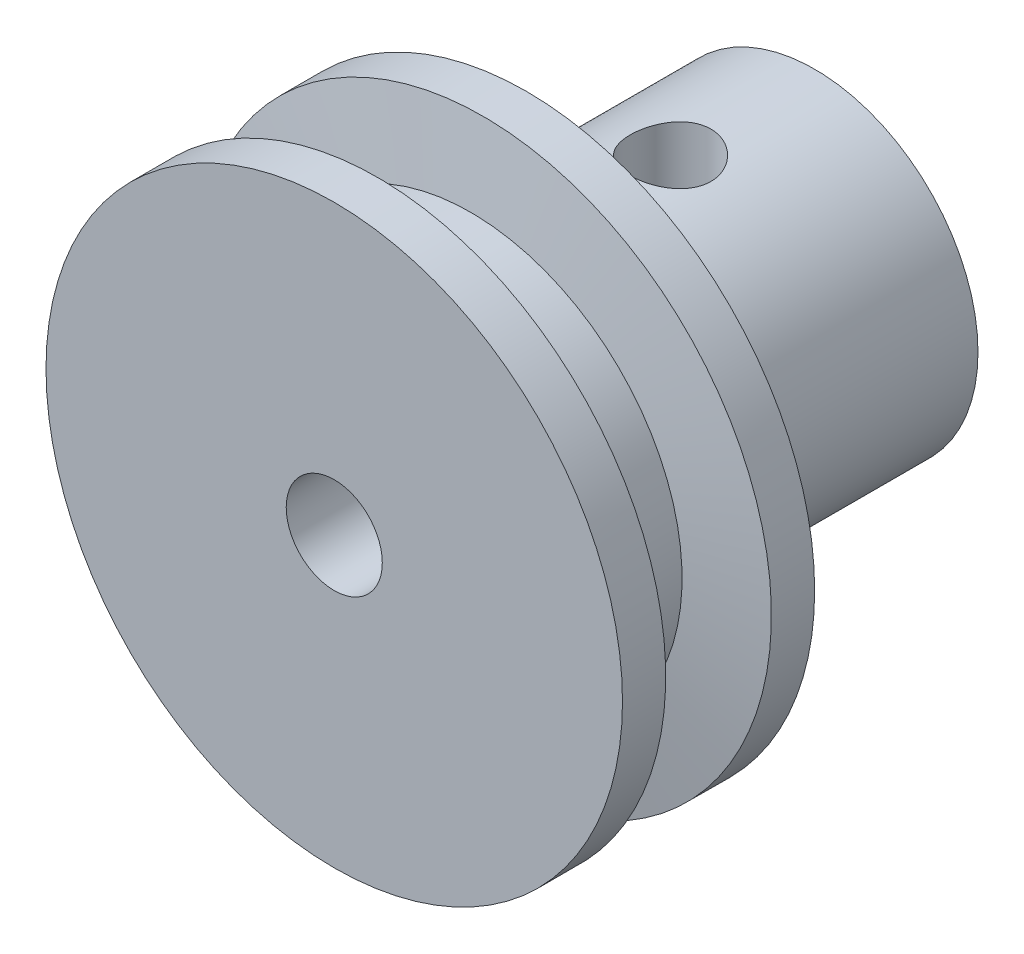
ISO-10303-21;
HEADER;
FILE_DESCRIPTION(('STEP AP214'),'2;1');
FILE_NAME('part.step','',(''),(''),'','','');
FILE_SCHEMA(('AUTOMOTIVE_DESIGN { 1 0 10303 214 1 1 1 1 }'));
ENDSEC;
DATA;
#1=APPLICATION_CONTEXT('core data for automotive mechanical design processes');
#2=APPLICATION_PROTOCOL_DEFINITION('international standard','automotive_design',2000,#1);
#3=PRODUCT_CONTEXT('',#1,'mechanical');
#4=PRODUCT('Part','Part','',(#3));
#5=PRODUCT_RELATED_PRODUCT_CATEGORY('part','',(#4));
#6=PRODUCT_DEFINITION_FORMATION('','',#4);
#7=PRODUCT_DEFINITION_CONTEXT('part definition',#1,'design');
#8=PRODUCT_DEFINITION('design','',#6,#7);
#9=PRODUCT_DEFINITION_SHAPE('','',#8);
#10=(LENGTH_UNIT() NAMED_UNIT(*) SI_UNIT(.MILLI.,.METRE.));
#11=(NAMED_UNIT(*) PLANE_ANGLE_UNIT() SI_UNIT($,.RADIAN.));
#12=(NAMED_UNIT(*) SI_UNIT($,.STERADIAN.) SOLID_ANGLE_UNIT());
#13=UNCERTAINTY_MEASURE_WITH_UNIT(LENGTH_MEASURE(1.E-05),#10,'distance_accuracy_value','');
#14=(GEOMETRIC_REPRESENTATION_CONTEXT(3) GLOBAL_UNCERTAINTY_ASSIGNED_CONTEXT((#13)) GLOBAL_UNIT_ASSIGNED_CONTEXT((#10,
#11,#12)) REPRESENTATION_CONTEXT('',''));
#15=CARTESIAN_POINT('',(0.,0.,0.));
#16=DIRECTION('',(0.,0.,1.));
#17=DIRECTION('',(1.,0.,0.));
#18=AXIS2_PLACEMENT_3D('',#15,#16,#17);
#19=CARTESIAN_POINT('',(0.,0.,0.));
#20=DIRECTION('',(0.,0.,1.));
#21=DIRECTION('',(1.,0.,0.));
#22=AXIS2_PLACEMENT_3D('',#19,#20,#21);
#23=PLANE('',#22);
#24=CARTESIAN_POINT('',(0.,0.,0.));
#25=DIRECTION('',(0.,0.,1.));
#26=DIRECTION('',(1.,0.,0.));
#27=AXIS2_PLACEMENT_3D('',#24,#25,#26);
#28=CIRCLE('',#27,15.);
#29=CARTESIAN_POINT('',(15.,0.,0.));
#30=VERTEX_POINT('',#29);
#31=EDGE_CURVE('E73',#30,#30,#28,.T.);
#32=ORIENTED_EDGE('',*,*,#31,.F.);
#33=EDGE_LOOP('',(#32));
#34=FACE_BOUND('',#33,.T.);
#35=CARTESIAN_POINT('',(0.,0.,0.));
#36=DIRECTION('',(0.,0.,1.));
#37=DIRECTION('',(1.,0.,0.));
#38=AXIS2_PLACEMENT_3D('',#35,#36,#37);
#39=CIRCLE('',#38,8.5);
#40=CARTESIAN_POINT('',(8.5,0.,0.));
#41=VERTEX_POINT('',#40);
#42=EDGE_CURVE('E58',#41,#41,#39,.F.);
#43=ORIENTED_EDGE('',*,*,#42,.F.);
#44=EDGE_LOOP('',(#43));
#45=FACE_BOUND('',#44,.T.);
#46=ADVANCED_FACE('F45',(#34,#45),#23,.F.);
#47=CARTESIAN_POINT('',(0.,0.,10.));
#48=DIRECTION('',(0.,0.,-1.));
#49=DIRECTION('',(-1.,0.,0.));
#50=AXIS2_PLACEMENT_3D('',#47,#48,#49);
#51=CYLINDRICAL_SURFACE('',#50,15.);
#52=CARTESIAN_POINT('',(0.,0.,2.25));
#53=DIRECTION('',(0.,0.,-1.));
#54=DIRECTION('',(-1.,0.,0.));
#55=AXIS2_PLACEMENT_3D('',#52,#53,#54);
#56=CIRCLE('',#55,15.);
#57=CARTESIAN_POINT('',(-15.,0.,2.25));
#58=VERTEX_POINT('',#57);
#59=EDGE_CURVE('E95',#58,#58,#56,.T.);
#60=ORIENTED_EDGE('',*,*,#59,.T.);
#61=EDGE_LOOP('',(#60));
#62=FACE_BOUND('',#61,.T.);
#63=ORIENTED_EDGE('',*,*,#31,.T.);
#64=EDGE_LOOP('',(#63));
#65=FACE_BOUND('',#64,.T.);
#66=ADVANCED_FACE('F147',(#62,#65),#51,.T.);
#67=CARTESIAN_POINT('',(0.,0.,10.));
#68=DIRECTION('',(0.,0.,1.));
#69=DIRECTION('',(1.,0.,0.));
#70=AXIS2_PLACEMENT_3D('',#67,#68,#69);
#71=PLANE('',#70);
#72=CARTESIAN_POINT('',(0.,0.,10.));
#73=DIRECTION('',(0.,0.,1.));
#74=DIRECTION('',(1.,0.,0.));
#75=AXIS2_PLACEMENT_3D('',#72,#73,#74);
#76=CIRCLE('',#75,15.);
#77=CARTESIAN_POINT('',(15.,0.,10.));
#78=VERTEX_POINT('',#77);
#79=EDGE_CURVE('E66',#78,#78,#76,.T.);
#80=ORIENTED_EDGE('',*,*,#79,.T.);
#81=EDGE_LOOP('',(#80));
#82=FACE_BOUND('',#81,.T.);
#83=CARTESIAN_POINT('',(0.,0.,10.));
#84=DIRECTION('',(0.,0.,1.));
#85=DIRECTION('',(1.,0.,0.));
#86=AXIS2_PLACEMENT_3D('',#83,#84,#85);
#87=CIRCLE('',#86,2.5);
#88=CARTESIAN_POINT('',(2.5,0.,10.));
#89=VERTEX_POINT('',#88);
#90=EDGE_CURVE('E78',#89,#89,#87,.T.);
#91=ORIENTED_EDGE('',*,*,#90,.F.);
#92=EDGE_LOOP('',(#91));
#93=FACE_BOUND('',#92,.T.);
#94=ADVANCED_FACE('F152',(#82,#93),#71,.T.);
#95=CARTESIAN_POINT('',(0.,0.,7.75));
#96=DIRECTION('',(0.,0.,-1.));
#97=DIRECTION('',(-1.,0.,0.));
#98=AXIS2_PLACEMENT_3D('',#95,#96,#97);
#99=CIRCLE('',#98,15.);
#100=CARTESIAN_POINT('',(-15.,0.,7.75));
#101=VERTEX_POINT('',#100);
#102=EDGE_CURVE('E91',#101,#101,#99,.T.);
#103=ORIENTED_EDGE('',*,*,#102,.F.);
#104=EDGE_LOOP('',(#103));
#105=FACE_BOUND('',#104,.T.);
#106=ORIENTED_EDGE('',*,*,#79,.F.);
#107=EDGE_LOOP('',(#106));
#108=FACE_BOUND('',#107,.T.);
#109=ADVANCED_FACE('F47',(#105,#108),#51,.T.);
#110=CARTESIAN_POINT('',(0.,0.,10.));
#111=DIRECTION('',(0.,0.,-1.));
#112=DIRECTION('',(-1.,0.,0.));
#113=AXIS2_PLACEMENT_3D('',#110,#111,#112);
#114=CYLINDRICAL_SURFACE('',#113,2.5);
#115=CARTESIAN_POINT('',(0.,2.5,-5.4));
#116=CARTESIAN_POINT('',(-0.0993730256022461,2.49999235681323,-5.40000781793011));
#117=CARTESIAN_POINT('',(-0.198894461648655,2.49401423672586,-5.40711498017375));
#118=CARTESIAN_POINT('',(-0.394712099458267,2.47062386361919,-5.43504526182494));
#119=CARTESIAN_POINT('',(-0.491000412558241,2.45318551674386,-5.45589968277776));
#120=CARTESIAN_POINT('',(-0.676934489714193,2.40849407320788,-5.50975669771903));
#121=CARTESIAN_POINT('',(-0.766619643075998,2.38130603299301,-5.54267879964616));
#122=CARTESIAN_POINT('',(-0.938364030346452,2.31901636821694,-5.61895818028129));
#123=CARTESIAN_POINT('',(-1.02042318288168,2.28391465922644,-5.66231557032156));
#124=CARTESIAN_POINT('',(-1.20508095932735,2.19360207513657,-5.77562296552621));
#125=CARTESIAN_POINT('',(-1.30400396937415,2.13576228881416,-5.84947093064105));
#126=CARTESIAN_POINT('',(-1.48564887479632,2.0136759023241,-6.01080975485163));
#127=CARTESIAN_POINT('',(-1.56832369757732,1.94941147777541,-6.09833897200533));
#128=CARTESIAN_POINT('',(-1.71877589361501,1.81821074291079,-6.28728115560702));
#129=CARTESIAN_POINT('',(-1.78623999238275,1.75124686144345,-6.38892653602663));
#130=CARTESIAN_POINT('',(-1.87423794813291,1.65503457960635,-6.55080085702952));
#131=CARTESIAN_POINT('',(-1.90135639211036,1.62369006147129,-6.60628416253611));
#132=CARTESIAN_POINT('',(-1.95101171748606,1.56366934291662,-6.72061693176481));
#133=CARTESIAN_POINT('',(-1.97355246264258,1.53499090340243,-6.77946350254044));
#134=CARTESIAN_POINT('',(-2.01536124409853,1.47973546664873,-6.90577598926492));
#135=CARTESIAN_POINT('',(-2.0342028938972,1.4535299349471,-6.97355200360077));
#136=CARTESIAN_POINT('',(-2.06527249369073,1.40903910635948,-7.11304686524534));
#137=CARTESIAN_POINT('',(-2.07751605234463,1.39073513788833,-7.18475596118885));
#138=CARTESIAN_POINT('',(-2.09459755052995,1.36488977022328,-7.33205840935943));
#139=CARTESIAN_POINT('',(-2.09933757951668,1.35749074972233,-7.40769002496613));
#140=CARTESIAN_POINT('',(-2.10053165369518,1.3556436780245,-7.55916748109201));
#141=CARTESIAN_POINT('',(-2.09698775837109,1.36119240785914,-7.6350132636843));
#142=CARTESIAN_POINT('',(-2.08157225094924,1.38464712394946,-7.78885282974416));
#143=CARTESIAN_POINT('',(-2.0691755235948,1.40333109380419,-7.86666697241062));
#144=CARTESIAN_POINT('',(-2.03663853769778,1.45013886604576,-8.01780525596749));
#145=CARTESIAN_POINT('',(-2.01647195943919,1.47829471204011,-8.09111314281686));
#146=CARTESIAN_POINT('',(-1.97403882515765,1.53432551020142,-8.2188639082892));
#147=CARTESIAN_POINT('',(-1.95296589301682,1.56116602160659,-8.27418089294589));
#148=CARTESIAN_POINT('',(-1.90677427610892,1.6172621810052,-8.38184018980982));
#149=CARTESIAN_POINT('',(-1.88165311554882,1.64651930156357,-8.43418065498234));
#150=CARTESIAN_POINT('',(-1.8004572205701,1.73632877202851,-8.58706358565845));
#151=CARTESIAN_POINT('',(-1.73857376837968,1.79888580247093,-8.6833982359188));
#152=CARTESIAN_POINT('',(-1.59579178548323,1.92697550014963,-8.87043234677266));
#153=CARTESIAN_POINT('',(-1.51398796192495,1.99246641213292,-8.96046570199204));
#154=CARTESIAN_POINT('',(-1.3336214739409,2.11741444234027,-9.12678562088634));
#155=CARTESIAN_POINT('',(-1.23509319570341,2.17688354894804,-9.20309974194954));
#156=CARTESIAN_POINT('',(-1.04606866583773,2.27250261099959,-9.32353247521397));
#157=CARTESIAN_POINT('',(-0.95885725983413,2.31087848129323,-9.37102495398802));
#158=CARTESIAN_POINT('',(-0.775629660941295,2.37863696788947,-9.45409663163172));
#159=CARTESIAN_POINT('',(-0.679618471130917,2.40802465366704,-9.48968254705532));
#160=CARTESIAN_POINT('',(-0.479938971914004,2.45565985501552,-9.54707692327323));
#161=CARTESIAN_POINT('',(-0.376214464265057,2.47381430175865,-9.56877033320969));
#162=CARTESIAN_POINT('',(-0.165239035352786,2.49678205720079,-9.59618202637023));
#163=CARTESIAN_POINT('',(-0.057991074303618,2.50160628914294,-9.60191338948291));
#164=CARTESIAN_POINT('',(0.141982570703234,2.4977064284626,-9.59726852179579));
#165=CARTESIAN_POINT('',(0.234797260987614,2.49064946589601,-9.58887441003991));
#166=CARTESIAN_POINT('',(0.417235152283125,2.46665360458316,-9.56020425062983));
#167=CARTESIAN_POINT('',(0.506858080344453,2.4497138628345,-9.53992718935777));
#168=CARTESIAN_POINT('',(0.680859199372361,2.40717070379505,-9.48863678480256));
#169=CARTESIAN_POINT('',(0.765231733506997,2.3815581272642,-9.4576120903166));
#170=CARTESIAN_POINT('',(0.927287359991367,2.32326696301429,-9.38626344462261));
#171=CARTESIAN_POINT('',(1.00496777424084,2.29058556464245,-9.34593579401625));
#172=CARTESIAN_POINT('',(1.18582278648895,2.20405034491775,-9.23762445954021));
#173=CARTESIAN_POINT('',(1.28500120331795,2.14723900759012,-9.16531190235931));
#174=CARTESIAN_POINT('',(1.46741117070229,2.02699462521279,-9.00710460353341));
#175=CARTESIAN_POINT('',(1.5505969802756,1.96354336556243,-8.92117214946343));
#176=CARTESIAN_POINT('',(1.70228679312989,1.83365930236986,-8.73565913179136));
#177=CARTESIAN_POINT('',(1.77049341616494,1.7671931544897,-8.63585708528871));
#178=CARTESIAN_POINT('',(1.85989841024774,1.6711398567174,-8.47695925667132));
#179=CARTESIAN_POINT('',(1.88753704511957,1.63974677213346,-8.42249485257979));
#180=CARTESIAN_POINT('',(1.93835723718053,1.57934206807542,-8.31028699777151));
#181=CARTESIAN_POINT('',(1.96154209274454,1.55032869543312,-8.25254601499346));
#182=CARTESIAN_POINT('',(2.00546732844908,1.49316445828113,-8.12690523804921));
#183=CARTESIAN_POINT('',(2.02564470128842,1.46547259201834,-8.05859137899237));
#184=CARTESIAN_POINT('',(2.05928882593353,1.41780992180363,-7.91778874499878));
#185=CARTESIAN_POINT('',(2.07277001860966,1.39782252357172,-7.84530933364985));
#186=CARTESIAN_POINT('',(2.09220045313067,1.36858699102638,-7.69600513659214));
#187=CARTESIAN_POINT('',(2.09804139433367,1.35949342538338,-7.61913365987381));
#188=CARTESIAN_POINT('',(2.1011194992483,1.35473717985816,-7.46481756352698));
#189=CARTESIAN_POINT('',(2.09836281059349,1.35906490322944,-7.38737339290835));
#190=CARTESIAN_POINT('',(2.08565152579525,1.37845870531476,-7.24637199565274));
#191=CARTESIAN_POINT('',(2.07682414703655,1.39183839640923,-7.18245758284944));
#192=CARTESIAN_POINT('',(2.05382763816654,1.42555682918548,-7.05746621043658));
#193=CARTESIAN_POINT('',(2.03965016544352,1.44590643472726,-6.996393850492));
#194=CARTESIAN_POINT('',(1.99332588452215,1.50969345143493,-6.82990705733826));
#195=CARTESIAN_POINT('',(1.95587568242065,1.55858039005568,-6.72808819304464));
#196=CARTESIAN_POINT('',(1.86775331734826,1.66319886386283,-6.534136948399));
#197=CARTESIAN_POINT('',(1.81704180517594,1.71895050312422,-6.44203456000804));
#198=CARTESIAN_POINT('',(1.69917403585596,1.83580085816791,-6.26095118475284));
#199=CARTESIAN_POINT('',(1.6311311726908,1.89700470554671,-6.17261302650126));
#200=CARTESIAN_POINT('',(1.48087039537917,2.01649069226848,-6.00684690091408));
#201=CARTESIAN_POINT('',(1.39867179886947,2.07477667537388,-5.92940432322561));
#202=CARTESIAN_POINT('',(1.22871778675754,2.17927144644783,-5.79386747806004));
#203=CARTESIAN_POINT('',(1.14226966651489,2.22610312268133,-5.73462611725147));
#204=CARTESIAN_POINT('',(0.958257418317807,2.31127343296889,-5.62837154461155));
#205=CARTESIAN_POINT('',(0.860700171208704,2.3496172814033,-5.5813508220903));
#206=CARTESIAN_POINT('',(0.67252347469818,2.40953347022021,-5.50846626963507));
#207=CARTESIAN_POINT('',(0.583294372598282,2.43280819164693,-5.48042033123051));
#208=CARTESIAN_POINT('',(0.400084141601298,2.46953481506509,-5.43632521458939));
#209=CARTESIAN_POINT('',(0.306115806920485,2.48301179337184,-5.42024540775815));
#210=CARTESIAN_POINT('',(0.176152977211515,2.49403576514249,-5.40710331428431));
#211=CARTESIAN_POINT('',(0.14102074194373,2.49626804937887,-5.40444394250827));
#212=CARTESIAN_POINT('',(0.0705986028557292,2.49925166865652,-5.40089072480559));
#213=CARTESIAN_POINT('',(0.0353086697141561,2.50000271573453,-5.39999722217664));
#214=CARTESIAN_POINT('',(0.,2.5,-5.4));
#215=B_SPLINE_CURVE_WITH_KNOTS('',3,(#115,#116,#117,#118,#119,#120,#121,#122,#123,#124,#125,
#126,#127,#128,#129,#130,#131,#132,#133,#134,#135,#136,#137,#138,#139,#140,#141,#142,#143,#144,
#145,#146,#147,#148,#149,#150,#151,#152,#153,#154,#155,#156,#157,#158,#159,#160,#161,#162,#163,
#164,#165,#166,#167,#168,#169,#170,#171,#172,#173,#174,#175,#176,#177,#178,#179,#180,#181,#182,
#183,#184,#185,#186,#187,#188,#189,#190,#191,#192,#193,#194,#195,#196,#197,#198,#199,#200,#201,
#202,#203,#204,#205,#206,#207,#208,#209,#210,#211,#212,#213,#214),.UNSPECIFIED.,.T.,.F.,(4,2,2,
2,2,2,2,2,2,2,2,2,2,2,2,2,2,2,2,2,2,2,2,2,2,2,2,2,2,2,2,2,2,2,2,2,2,2,2,2,2,2,2,2,2,2,2,2,2,4),
(0.,0.297962620674467,0.596606035663124,0.893292691432597,1.18998251264047,1.59675200685626,
2.00468312125291,2.42037345900016,2.62792558018693,2.83530178438657,3.05987449559393,
3.28391359186869,3.51085267450524,3.73773534333245,3.9793303945996,4.22175112797397,
4.41648056644973,4.61132955161958,5.00126650512848,5.4141704598235,5.8262355276747,
6.14441396184945,6.46241260611802,6.78301181803362,7.10334824175017,7.38236969632225,
7.66141495494252,7.94075583262647,8.22020798461904,8.62374969606758,9.0284289578335,
9.44053313859821,9.64634836985898,9.85201058606809,10.0806637317801,10.3088216034389,
10.5401797720754,10.7713725487261,10.9683042381135,11.1655442883211,11.5205132267229,
11.8765476282863,12.2568989386322,12.6367352566501,12.9798180218012,13.3226894301976,
13.610660066359,13.8978910513837,14.0037408934564,14.1096113114778),.UNSPECIFIED.);
#216=CARTESIAN_POINT('',(0.,2.5,-5.4));
#217=VERTEX_POINT('',#216);
#218=EDGE_CURVE('E107',#217,#217,#215,.T.);
#219=ORIENTED_EDGE('',*,*,#218,.F.);
#220=EDGE_LOOP('',(#219));
#221=FACE_BOUND('',#220,.T.);
#222=ORIENTED_EDGE('',*,*,#90,.T.);
#223=EDGE_LOOP('',(#222));
#224=FACE_BOUND('',#223,.T.);
#225=CARTESIAN_POINT('',(0.,0.,-15.));
#226=DIRECTION('',(0.,0.,-1.));
#227=DIRECTION('',(-1.,0.,0.));
#228=AXIS2_PLACEMENT_3D('',#225,#226,#227);
#229=CIRCLE('',#228,2.5);
#230=CARTESIAN_POINT('',(-2.5,0.,-15.));
#231=VERTEX_POINT('',#230);
#232=EDGE_CURVE('E103',#231,#231,#229,.T.);
#233=ORIENTED_EDGE('',*,*,#232,.T.);
#234=EDGE_LOOP('',(#233));
#235=FACE_BOUND('',#234,.T.);
#236=ADVANCED_FACE('F113',(#221,#224,#235),#114,.F.);
#237=CARTESIAN_POINT('',(0.,0.,2.9));
#238=DIRECTION('',(0.,0.,-1.));
#239=DIRECTION('',(-1.,0.,0.));
#240=AXIS2_PLACEMENT_3D('',#237,#238,#239);
#241=CONICAL_SURFACE('',#240,11.,1.40970442225732);
#242=ORIENTED_EDGE('',*,*,#59,.F.);
#243=EDGE_LOOP('',(#242));
#244=FACE_BOUND('',#243,.T.);
#245=CARTESIAN_POINT('',(0.,0.,2.9));
#246=DIRECTION('',(0.,0.,-1.));
#247=DIRECTION('',(-1.,0.,0.));
#248=AXIS2_PLACEMENT_3D('',#245,#246,#247);
#249=CIRCLE('',#248,11.);
#250=CARTESIAN_POINT('',(-11.,0.,2.9));
#251=VERTEX_POINT('',#250);
#252=EDGE_CURVE('E83',#251,#251,#249,.T.);
#253=ORIENTED_EDGE('',*,*,#252,.T.);
#254=EDGE_LOOP('',(#253));
#255=FACE_BOUND('',#254,.T.);
#256=ADVANCED_FACE('F136',(#244,#255),#241,.T.);
#257=CARTESIAN_POINT('',(0.,0.,0.));
#258=DIRECTION('',(0.,0.,-1.));
#259=DIRECTION('',(-1.,0.,0.));
#260=AXIS2_PLACEMENT_3D('',#257,#258,#259);
#261=CYLINDRICAL_SURFACE('',#260,11.);
#262=ORIENTED_EDGE('',*,*,#252,.F.);
#263=EDGE_LOOP('',(#262));
#264=FACE_BOUND('',#263,.T.);
#265=CARTESIAN_POINT('',(0.,0.,7.1));
#266=DIRECTION('',(0.,0.,-1.));
#267=DIRECTION('',(-1.,0.,0.));
#268=AXIS2_PLACEMENT_3D('',#265,#266,#267);
#269=CIRCLE('',#268,11.);
#270=CARTESIAN_POINT('',(-11.,0.,7.1));
#271=VERTEX_POINT('',#270);
#272=EDGE_CURVE('E87',#271,#271,#269,.T.);
#273=ORIENTED_EDGE('',*,*,#272,.T.);
#274=EDGE_LOOP('',(#273));
#275=FACE_BOUND('',#274,.T.);
#276=ADVANCED_FACE('F133',(#264,#275),#261,.T.);
#277=CARTESIAN_POINT('',(0.,0.,7.75));
#278=DIRECTION('',(0.,0.,1.));
#279=DIRECTION('',(1.,0.,0.));
#280=AXIS2_PLACEMENT_3D('',#277,#278,#279);
#281=CONICAL_SURFACE('',#280,15.,1.40970442225732);
#282=ORIENTED_EDGE('',*,*,#272,.F.);
#283=EDGE_LOOP('',(#282));
#284=FACE_BOUND('',#283,.T.);
#285=ORIENTED_EDGE('',*,*,#102,.T.);
#286=EDGE_LOOP('',(#285));
#287=FACE_BOUND('',#286,.T.);
#288=ADVANCED_FACE('F126',(#284,#287),#281,.T.);
#289=CARTESIAN_POINT('',(0.,0.,-15.));
#290=DIRECTION('',(0.,0.,-1.));
#291=DIRECTION('',(-1.,0.,0.));
#292=AXIS2_PLACEMENT_3D('',#289,#290,#291);
#293=PLANE('',#292);
#294=CARTESIAN_POINT('',(0.,0.,-15.));
#295=DIRECTION('',(0.,0.,-1.));
#296=DIRECTION('',(-1.,0.,0.));
#297=AXIS2_PLACEMENT_3D('',#294,#295,#296);
#298=CIRCLE('',#297,8.5);
#299=CARTESIAN_POINT('',(-8.5,0.,-15.));
#300=VERTEX_POINT('',#299);
#301=EDGE_CURVE('E99',#300,#300,#298,.T.);
#302=ORIENTED_EDGE('',*,*,#301,.T.);
#303=EDGE_LOOP('',(#302));
#304=FACE_BOUND('',#303,.T.);
#305=ORIENTED_EDGE('',*,*,#232,.F.);
#306=EDGE_LOOP('',(#305));
#307=FACE_BOUND('',#306,.T.);
#308=ADVANCED_FACE('F123',(#304,#307),#293,.T.);
#309=CARTESIAN_POINT('',(0.,0.,-15.));
#310=DIRECTION('',(0.,0.,1.));
#311=DIRECTION('',(1.,0.,0.));
#312=AXIS2_PLACEMENT_3D('',#309,#310,#311);
#313=CYLINDRICAL_SURFACE('',#312,8.5);
#314=CARTESIAN_POINT('',(0.,8.5,-5.4));
#315=CARTESIAN_POINT('',(-0.116070693783538,8.49999800918138,-5.40000333596577));
#316=CARTESIAN_POINT('',(-0.232178931507366,8.49759878198986,-5.40965553394515));
#317=CARTESIAN_POINT('',(-0.461070671457287,8.48826019005853,-5.44795324794818));
#318=CARTESIAN_POINT('',(-0.573852200824808,8.48131818569408,-5.4766098067697));
#319=CARTESIAN_POINT('',(-0.792751820834902,8.4636631789589,-5.55194291704333));
#320=CARTESIAN_POINT('',(-0.89887763882598,8.4529546487778,-5.59859810413117));
#321=CARTESIAN_POINT('',(-1.101795889815,8.42890856098788,-5.70852964894613));
#322=CARTESIAN_POINT('',(-1.19858806150874,8.41557092980669,-5.77180647182699));
#323=CARTESIAN_POINT('',(-1.38204204743677,8.38741545366713,-5.91453202560296));
#324=CARTESIAN_POINT('',(-1.46848899994257,8.37257520158859,-5.99425252628489));
#325=CARTESIAN_POINT('',(-1.62693162811332,8.34323680807366,-6.16702044635572));
#326=CARTESIAN_POINT('',(-1.69892570884804,8.32873870455029,-6.26006933464435));
#327=CARTESIAN_POINT('',(-1.82742321348222,8.30150075832169,-6.45851311188195));
#328=CARTESIAN_POINT('',(-1.88368744106863,8.28878938984669,-6.56406714959781));
#329=CARTESIAN_POINT('',(-1.97759026550094,8.26689043584017,-6.78349995477977));
#330=CARTESIAN_POINT('',(-2.01523176369654,8.25770230145251,-6.89737742231253));
#331=CARTESIAN_POINT('',(-2.07008989778017,8.24412023188701,-7.12786494816019));
#332=CARTESIAN_POINT('',(-2.0876922909958,8.23963588576778,-7.24437774215349));
#333=CARTESIAN_POINT('',(-2.10317392244256,8.23569841674094,-7.47878226349085));
#334=CARTESIAN_POINT('',(-2.10105628974613,8.23624449563117,-7.59667376910316));
#335=CARTESIAN_POINT('',(-2.0774660222764,8.24222484505404,-7.8275417027406));
#336=CARTESIAN_POINT('',(-2.05645188771728,8.2475433130365,-7.940568447536));
#337=CARTESIAN_POINT('',(-1.99639604097165,8.26228478094194,-8.16144047589325));
#338=CARTESIAN_POINT('',(-1.95735307129965,8.27170806716753,-8.26928539745095));
#339=CARTESIAN_POINT('',(-1.86195414628767,8.29370446491965,-8.47796778763907));
#340=CARTESIAN_POINT('',(-1.80543081547591,8.30630780093839,-8.57872542119745));
#341=CARTESIAN_POINT('',(-1.6767927742621,8.33322701442431,-8.7694906831448));
#342=CARTESIAN_POINT('',(-1.60467539444526,8.34754318490962,-8.85949646691424));
#343=CARTESIAN_POINT('',(-1.4445162360684,8.3767635143311,-9.02883185343105));
#344=CARTESIAN_POINT('',(-1.35608723477596,8.3916729506971,-9.10779475648055));
#345=CARTESIAN_POINT('',(-1.16706456232543,8.42004037693619,-9.24983908430539));
#346=CARTESIAN_POINT('',(-1.06647053662144,8.43349832448445,-9.31292004604123));
#347=CARTESIAN_POINT('',(-0.855457643869528,8.45751088439129,-9.42154004850335));
#348=CARTESIAN_POINT('',(-0.745007532215942,8.46805579593392,-9.46702067447091));
#349=CARTESIAN_POINT('',(-0.517711266923944,8.48498349628455,-9.53866793507334));
#350=CARTESIAN_POINT('',(-0.400866311702717,8.49136706206861,-9.56483817532269));
#351=CARTESIAN_POINT('',(-0.167233380306472,8.49913827042422,-9.59656442260855));
#352=CARTESIAN_POINT('',(-0.0505171631569315,8.50064694690211,-9.60261994736803));
#353=CARTESIAN_POINT('',(0.182260721658087,8.49884256411876,-9.59531331022415));
#354=CARTESIAN_POINT('',(0.298322445878948,8.49552992808544,-9.58195285270862));
#355=CARTESIAN_POINT('',(0.524768996392018,8.48453258186189,-9.53660553280182));
#356=CARTESIAN_POINT('',(0.635211561903025,8.47691162844813,-9.50489013767833));
#357=CARTESIAN_POINT('',(0.849203770924829,8.45815586843028,-9.42404242987764));
#358=CARTESIAN_POINT('',(0.952752726652835,8.44702071184472,-9.37490838240699));
#359=CARTESIAN_POINT('',(1.1520135693382,8.42218087597783,-9.25964287142086));
#360=CARTESIAN_POINT('',(1.24755754490001,8.40843482092409,-9.19323026694969));
#361=CARTESIAN_POINT('',(1.42632231861542,8.3799649385122,-9.04565325626291));
#362=CARTESIAN_POINT('',(1.5095410381837,8.3652409468356,-8.96448636694907));
#363=CARTESIAN_POINT('',(1.66334338160458,8.33604069535196,-8.78738790422769));
#364=CARTESIAN_POINT('',(1.73357700324382,8.32157879479109,-8.69114949854572));
#365=CARTESIAN_POINT('',(1.85689585617096,8.29493421645405,-8.48795688849484));
#366=CARTESIAN_POINT('',(1.90998185206615,8.28275143706276,-8.38100316219744));
#367=CARTESIAN_POINT('',(1.99710541107696,8.26217736387936,-8.15999316098096));
#368=CARTESIAN_POINT('',(2.03125583008345,8.25376366543388,-8.04598356876088));
#369=CARTESIAN_POINT('',(2.0798403875698,8.2416565457551,-7.81360231526315));
#370=CARTESIAN_POINT('',(2.09427871798651,8.23796212094042,-7.69523158691724));
#371=CARTESIAN_POINT('',(2.10281410073504,8.23578705986035,-7.46104632145049));
#372=CARTESIAN_POINT('',(2.09747007102311,8.23716315917082,-7.34525315593378));
#373=CARTESIAN_POINT('',(2.06786865880553,8.24464357771109,-7.11627375669289));
#374=CARTESIAN_POINT('',(2.04361163932658,8.25074780618647,-7.00308747297368));
#375=CARTESIAN_POINT('',(1.97717474930079,8.26691779751331,-6.78312621923407));
#376=CARTESIAN_POINT('',(1.93509738745014,8.27696087867693,-6.67631850593222));
#377=CARTESIAN_POINT('',(1.83429576377406,8.29988065646576,-6.47120335041539));
#378=CARTESIAN_POINT('',(1.77556924697779,8.31275773687651,-6.37289706199351));
#379=CARTESIAN_POINT('',(1.64137406248712,8.34030506654025,-6.18486894734274));
#380=CARTESIAN_POINT('',(1.56551650902379,8.35501268049769,-6.09543009481794));
#381=CARTESIAN_POINT('',(1.39997348106837,8.38433823620064,-5.93036932019924));
#382=CARTESIAN_POINT('',(1.31028473900063,8.39895615590543,-5.85475067233448));
#383=CARTESIAN_POINT('',(1.11772312624881,8.42676166757186,-5.71818323275696));
#384=CARTESIAN_POINT('',(1.01464627268259,8.43991961118844,-5.65751557760958));
#385=CARTESIAN_POINT('',(0.799442190601991,8.46301158765902,-5.55446606532308));
#386=CARTESIAN_POINT('',(0.687321631029135,8.47294796947706,-5.51207087756596));
#387=CARTESIAN_POINT('',(0.47947286597457,8.48697753544662,-5.45319051736021));
#388=CARTESIAN_POINT('',(0.384749523490452,8.49182775309005,-5.43328666342242));
#389=CARTESIAN_POINT('',(0.193359379012435,8.4983397003884,-5.40669048843594));
#390=CARTESIAN_POINT('',(0.0966927167403746,8.50000165845189,-5.39999722097299));
#391=CARTESIAN_POINT('',(0.,8.5,-5.4));
#392=B_SPLINE_CURVE_WITH_KNOTS('',3,(#314,#315,#316,#317,#318,#319,#320,#321,#322,#323,#324,
#325,#326,#327,#328,#329,#330,#331,#332,#333,#334,#335,#336,#337,#338,#339,#340,#341,#342,#343,
#344,#345,#346,#347,#348,#349,#350,#351,#352,#353,#354,#355,#356,#357,#358,#359,#360,#361,#362,
#363,#364,#365,#366,#367,#368,#369,#370,#371,#372,#373,#374,#375,#376,#377,#378,#379,#380,#381,
#382,#383,#384,#385,#386,#387,#388,#389,#390,#391),.UNSPECIFIED.,.T.,.F.,(4,2,2,2,2,2,2,2,2,2,2,
2,2,2,2,2,2,2,2,2,2,2,2,2,2,2,2,2,2,2,2,2,2,2,2,2,2,2,4),(0.,0.34785777995165,0.695917865723665,
1.04356606924931,1.39122400268944,1.74516924484556,2.09915352478134,2.45825939977015,
2.81730930981123,3.16932391857982,3.52128267243011,3.86492538124192,4.20859206226294,
4.5556569609785,4.90278131793042,5.25956329749736,5.6163556778723,5.97432228356676,
6.33222203319572,6.68116468034581,7.03007669820961,7.37395563589729,7.71786883149361,
8.06777200521294,8.41773412111265,8.77607061137681,9.13439112132212,9.4905524360692,
9.84663799839615,10.192740734927,10.5388368283283,10.8829685353473,11.2271468740422,
11.5801054618945,11.9331475632288,12.2923934974479,12.6513768995255,12.9411806613562,
13.2309636607197),.UNSPECIFIED.);
#393=CARTESIAN_POINT('',(0.,8.5,-5.4));
#394=VERTEX_POINT('',#393);
#395=EDGE_CURVE('E10',#394,#394,#392,.T.);
#396=ORIENTED_EDGE('',*,*,#395,.T.);
#397=EDGE_LOOP('',(#396));
#398=FACE_BOUND('',#397,.T.);
#399=ORIENTED_EDGE('',*,*,#301,.F.);
#400=EDGE_LOOP('',(#399));
#401=FACE_BOUND('',#400,.T.);
#402=ORIENTED_EDGE('',*,*,#42,.T.);
#403=EDGE_LOOP('',(#402));
#404=FACE_BOUND('',#403,.T.);
#405=ADVANCED_FACE('F121',(#398,#401,#404),#313,.T.);
#406=CARTESIAN_POINT('',(0.,8.5,-7.5));
#407=DIRECTION('',(0.,1.,0.));
#408=DIRECTION('',(0.,0.,1.));
#409=AXIS2_PLACEMENT_3D('',#406,#407,#408);
#410=CYLINDRICAL_SURFACE('',#409,2.1);
#411=ORIENTED_EDGE('',*,*,#218,.T.);
#412=EDGE_LOOP('',(#411));
#413=FACE_BOUND('',#412,.T.);
#414=ORIENTED_EDGE('',*,*,#395,.F.);
#415=EDGE_LOOP('',(#414));
#416=FACE_BOUND('',#415,.T.);
#417=ADVANCED_FACE('F117',(#413,#416),#410,.F.);
#418=CLOSED_SHELL('',(#46,#66,#94,#109,#236,#256,#276,#288,#308,#405,#417));
#419=MANIFOLD_SOLID_BREP('B2',#418);
#420=ADVANCED_BREP_SHAPE_REPRESENTATION('',(#18,#419),#14);
#421=SHAPE_DEFINITION_REPRESENTATION(#9,#420);
ENDSEC;
END-ISO-10303-21;
